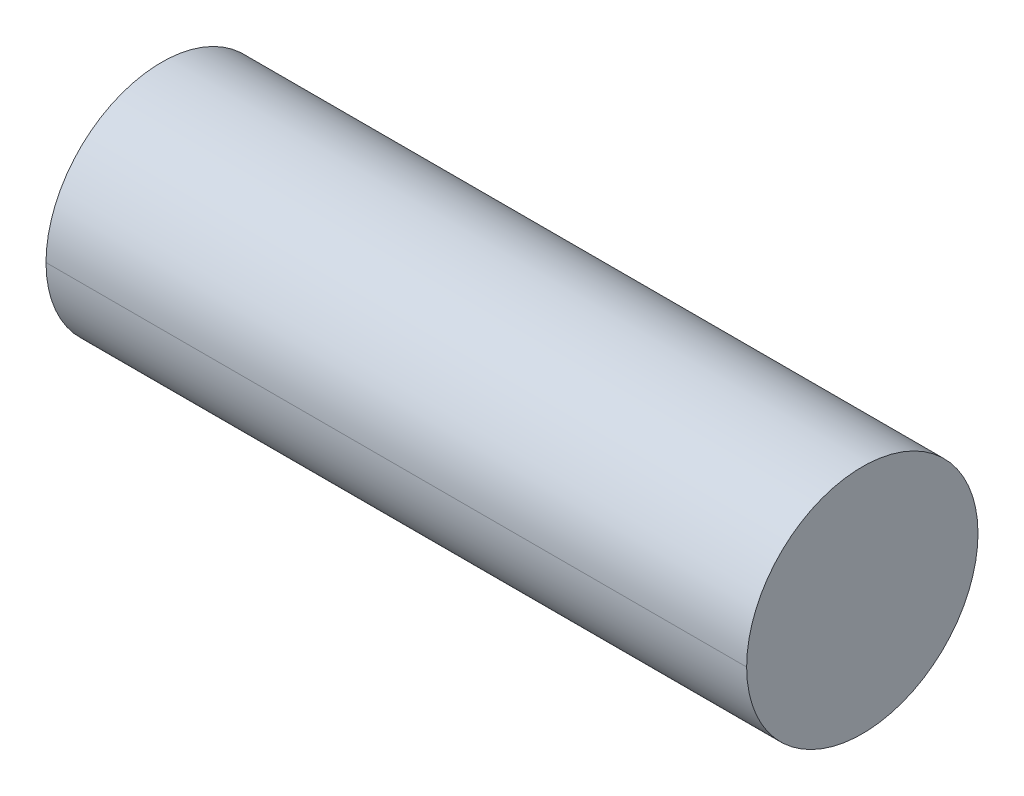
ISO-10303-21;
HEADER;
FILE_DESCRIPTION(('STEP AP214'),'2;1');
FILE_NAME('part.step','',(''),(''),'','','');
FILE_SCHEMA(('AUTOMOTIVE_DESIGN { 1 0 10303 214 1 1 1 1 }'));
ENDSEC;
DATA;
#1=APPLICATION_CONTEXT('core data for automotive mechanical design processes');
#2=APPLICATION_PROTOCOL_DEFINITION('international standard','automotive_design',2000,#1);
#3=PRODUCT_CONTEXT('',#1,'mechanical');
#4=PRODUCT('Part','Part','',(#3));
#5=PRODUCT_RELATED_PRODUCT_CATEGORY('part','',(#4));
#6=PRODUCT_DEFINITION_FORMATION('','',#4);
#7=PRODUCT_DEFINITION_CONTEXT('part definition',#1,'design');
#8=PRODUCT_DEFINITION('design','',#6,#7);
#9=PRODUCT_DEFINITION_SHAPE('','',#8);
#10=(LENGTH_UNIT() NAMED_UNIT(*) SI_UNIT(.MILLI.,.METRE.));
#11=(NAMED_UNIT(*) PLANE_ANGLE_UNIT() SI_UNIT($,.RADIAN.));
#12=(NAMED_UNIT(*) SI_UNIT($,.STERADIAN.) SOLID_ANGLE_UNIT());
#13=UNCERTAINTY_MEASURE_WITH_UNIT(LENGTH_MEASURE(1.E-05),#10,'distance_accuracy_value','');
#14=(GEOMETRIC_REPRESENTATION_CONTEXT(3) GLOBAL_UNCERTAINTY_ASSIGNED_CONTEXT((#13)) GLOBAL_UNIT_ASSIGNED_CONTEXT((#10,
#11,#12)) REPRESENTATION_CONTEXT('',''));
#15=CARTESIAN_POINT('',(0.,0.,0.));
#16=DIRECTION('',(0.,0.,1.));
#17=DIRECTION('',(1.,0.,0.));
#18=AXIS2_PLACEMENT_3D('',#15,#16,#17);
#19=CARTESIAN_POINT('',(-5.,0.,0.));
#20=DIRECTION('',(1.,0.,0.));
#21=DIRECTION('',(0.,0.,-1.));
#22=AXIS2_PLACEMENT_3D('',#19,#20,#21);
#23=PLANE('',#22);
#24=CARTESIAN_POINT('',(-5.,0.,0.));
#25=DIRECTION('',(1.,0.,0.));
#26=DIRECTION('',(0.,0.,1.));
#27=AXIS2_PLACEMENT_3D('',#24,#25,#26);
#28=CIRCLE('',#27,1.651);
#29=CARTESIAN_POINT('',(-5.,0.,1.651));
#30=VERTEX_POINT('',#29);
#31=CARTESIAN_POINT('',(-5.,0.,-1.651));
#32=VERTEX_POINT('',#31);
#33=EDGE_CURVE('E43',#30,#32,#28,.T.);
#34=ORIENTED_EDGE('',*,*,#33,.F.);
#35=CARTESIAN_POINT('',(-5.,0.,0.));
#36=DIRECTION('',(1.,0.,0.));
#37=DIRECTION('',(0.,0.,-1.));
#38=AXIS2_PLACEMENT_3D('',#35,#36,#37);
#39=CIRCLE('',#38,1.651);
#40=EDGE_CURVE('E11',#32,#30,#39,.T.);
#41=ORIENTED_EDGE('',*,*,#40,.F.);
#42=EDGE_LOOP('',(#34,#41));
#43=FACE_BOUND('',#42,.T.);
#44=ADVANCED_FACE('F17',(#43),#23,.F.);
#45=CARTESIAN_POINT('',(-6.2865,0.,0.));
#46=DIRECTION('',(1.,0.,0.));
#47=DIRECTION('',(0.,0.,-1.));
#48=AXIS2_PLACEMENT_3D('',#45,#46,#47);
#49=CYLINDRICAL_SURFACE('',#48,1.651);
#50=DIRECTION('',(-1.,0.,0.));
#51=VECTOR('',#50,1.);
#52=CARTESIAN_POINT('',(5.,0.,-1.65099999999999));
#53=LINE('',#52,#51);
#54=CARTESIAN_POINT('',(5.,0.,-1.65099999999999));
#55=VERTEX_POINT('',#54);
#56=EDGE_CURVE('E20',#55,#32,#53,.T.);
#57=ORIENTED_EDGE('',*,*,#56,.T.);
#58=ORIENTED_EDGE('',*,*,#40,.T.);
#59=DIRECTION('',(-1.,0.,0.));
#60=VECTOR('',#59,1.);
#61=CARTESIAN_POINT('',(5.,0.,1.65100000000001));
#62=LINE('',#61,#60);
#63=CARTESIAN_POINT('',(5.,0.,1.65100000000001));
#64=VERTEX_POINT('',#63);
#65=EDGE_CURVE('E33',#64,#30,#62,.T.);
#66=ORIENTED_EDGE('',*,*,#65,.F.);
#67=CARTESIAN_POINT('',(5.,0.,0.));
#68=DIRECTION('',(1.,0.,0.));
#69=DIRECTION('',(0.,0.,-1.));
#70=AXIS2_PLACEMENT_3D('',#67,#68,#69);
#71=CIRCLE('',#70,1.651);
#72=EDGE_CURVE('E25',#55,#64,#71,.T.);
#73=ORIENTED_EDGE('',*,*,#72,.F.);
#74=EDGE_LOOP('',(#57,#58,#66,#73));
#75=FACE_BOUND('',#74,.T.);
#76=ADVANCED_FACE('F44',(#75),#49,.T.);
#77=CARTESIAN_POINT('',(5.,0.,0.));
#78=DIRECTION('',(1.,0.,0.));
#79=DIRECTION('',(0.,0.,-1.));
#80=AXIS2_PLACEMENT_3D('',#77,#78,#79);
#81=PLANE('',#80);
#82=CARTESIAN_POINT('',(5.,0.,0.));
#83=DIRECTION('',(1.,0.,0.));
#84=DIRECTION('',(0.,0.,1.));
#85=AXIS2_PLACEMENT_3D('',#82,#83,#84);
#86=CIRCLE('',#85,1.651);
#87=EDGE_CURVE('E48',#64,#55,#86,.T.);
#88=ORIENTED_EDGE('',*,*,#87,.T.);
#89=ORIENTED_EDGE('',*,*,#72,.T.);
#90=EDGE_LOOP('',(#88,#89));
#91=FACE_BOUND('',#90,.T.);
#92=ADVANCED_FACE('F54',(#91),#81,.T.);
#93=CARTESIAN_POINT('',(-6.2865,0.,0.));
#94=DIRECTION('',(1.,0.,0.));
#95=DIRECTION('',(0.,0.,-1.));
#96=AXIS2_PLACEMENT_3D('',#93,#94,#95);
#97=CYLINDRICAL_SURFACE('',#96,1.651);
#98=ORIENTED_EDGE('',*,*,#65,.T.);
#99=ORIENTED_EDGE('',*,*,#33,.T.);
#100=ORIENTED_EDGE('',*,*,#56,.F.);
#101=ORIENTED_EDGE('',*,*,#87,.F.);
#102=EDGE_LOOP('',(#98,#99,#100,#101));
#103=FACE_BOUND('',#102,.T.);
#104=ADVANCED_FACE('F47',(#103),#97,.T.);
#105=CLOSED_SHELL('',(#44,#76,#92,#104));
#106=MANIFOLD_SOLID_BREP('B1',#105);
#107=ADVANCED_BREP_SHAPE_REPRESENTATION('',(#18,#106),#14);
#108=SHAPE_DEFINITION_REPRESENTATION(#9,#107);
ENDSEC;
END-ISO-10303-21;
